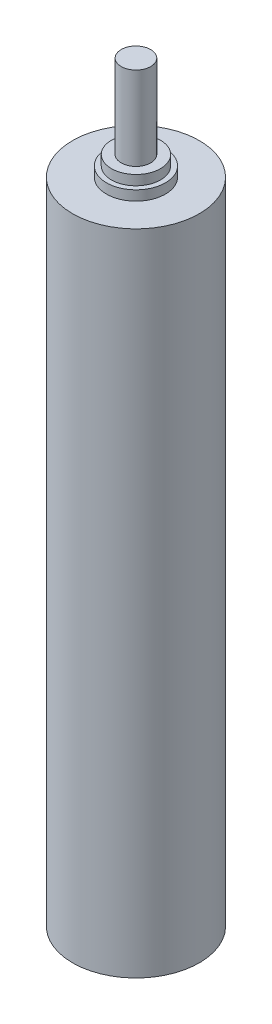
ISO-10303-21;
HEADER;
FILE_DESCRIPTION(('STEP AP214'),'2;1');
FILE_NAME('part.step','',(''),(''),'','','');
FILE_SCHEMA(('AUTOMOTIVE_DESIGN { 1 0 10303 214 1 1 1 1 }'));
ENDSEC;
DATA;
#1=APPLICATION_CONTEXT('core data for automotive mechanical design processes');
#2=APPLICATION_PROTOCOL_DEFINITION('international standard','automotive_design',2000,#1);
#3=PRODUCT_CONTEXT('',#1,'mechanical');
#4=PRODUCT('Part','Part','',(#3));
#5=PRODUCT_RELATED_PRODUCT_CATEGORY('part','',(#4));
#6=PRODUCT_DEFINITION_FORMATION('','',#4);
#7=PRODUCT_DEFINITION_CONTEXT('part definition',#1,'design');
#8=PRODUCT_DEFINITION('design','',#6,#7);
#9=PRODUCT_DEFINITION_SHAPE('','',#8);
#10=(LENGTH_UNIT() NAMED_UNIT(*) SI_UNIT(.MILLI.,.METRE.));
#11=(NAMED_UNIT(*) PLANE_ANGLE_UNIT() SI_UNIT($,.RADIAN.));
#12=(NAMED_UNIT(*) SI_UNIT($,.STERADIAN.) SOLID_ANGLE_UNIT());
#13=UNCERTAINTY_MEASURE_WITH_UNIT(LENGTH_MEASURE(1.E-05),#10,'distance_accuracy_value','');
#14=(GEOMETRIC_REPRESENTATION_CONTEXT(3) GLOBAL_UNCERTAINTY_ASSIGNED_CONTEXT((#13)) GLOBAL_UNIT_ASSIGNED_CONTEXT((#10,
#11,#12)) REPRESENTATION_CONTEXT('',''));
#15=CARTESIAN_POINT('',(0.,0.,0.));
#16=DIRECTION('',(0.,0.,1.));
#17=DIRECTION('',(1.,0.,0.));
#18=AXIS2_PLACEMENT_3D('',#15,#16,#17);
#19=CARTESIAN_POINT('',(0.,66.04,0.));
#20=DIRECTION('',(0.,1.,0.));
#21=DIRECTION('',(0.,0.,1.));
#22=AXIS2_PLACEMENT_3D('',#19,#20,#21);
#23=PLANE('',#22);
#24=CARTESIAN_POINT('',(0.,66.04,0.));
#25=DIRECTION('',(0.,1.,0.));
#26=DIRECTION('',(0.,0.,1.));
#27=AXIS2_PLACEMENT_3D('',#24,#25,#26);
#28=CIRCLE('',#27,6.4516);
#29=CARTESIAN_POINT('',(0.,66.04,6.4516));
#30=VERTEX_POINT('',#29);
#31=EDGE_CURVE('E10',#30,#30,#28,.T.);
#32=ORIENTED_EDGE('',*,*,#31,.T.);
#33=EDGE_LOOP('',(#32));
#34=FACE_BOUND('',#33,.T.);
#35=CARTESIAN_POINT('',(0.,66.04,0.));
#36=DIRECTION('',(0.,-1.,0.));
#37=DIRECTION('',(0.,0.,-1.));
#38=AXIS2_PLACEMENT_3D('',#35,#36,#37);
#39=CIRCLE('',#38,3.);
#40=CARTESIAN_POINT('',(0.,66.04,-3.));
#41=VERTEX_POINT('',#40);
#42=EDGE_CURVE('E58',#41,#41,#39,.T.);
#43=ORIENTED_EDGE('',*,*,#42,.T.);
#44=EDGE_LOOP('',(#43));
#45=FACE_BOUND('',#44,.T.);
#46=ADVANCED_FACE('F31',(#34,#45),#23,.T.);
#47=CARTESIAN_POINT('',(0.,66.04,0.));
#48=DIRECTION('',(0.,-1.,0.));
#49=DIRECTION('',(0.,0.,-1.));
#50=AXIS2_PLACEMENT_3D('',#47,#48,#49);
#51=CYLINDRICAL_SURFACE('',#50,6.4516);
#52=ORIENTED_EDGE('',*,*,#31,.F.);
#53=EDGE_LOOP('',(#52));
#54=FACE_BOUND('',#53,.T.);
#55=CARTESIAN_POINT('',(0.,0.,0.));
#56=DIRECTION('',(0.,1.,0.));
#57=DIRECTION('',(0.,0.,1.));
#58=AXIS2_PLACEMENT_3D('',#55,#56,#57);
#59=CIRCLE('',#58,6.4516);
#60=CARTESIAN_POINT('',(0.,0.,6.4516));
#61=VERTEX_POINT('',#60);
#62=EDGE_CURVE('E35',#61,#61,#59,.T.);
#63=ORIENTED_EDGE('',*,*,#62,.T.);
#64=EDGE_LOOP('',(#63));
#65=FACE_BOUND('',#64,.T.);
#66=ADVANCED_FACE('F33',(#54,#65),#51,.T.);
#67=CARTESIAN_POINT('',(0.,0.,0.));
#68=DIRECTION('',(0.,1.,0.));
#69=DIRECTION('',(0.,0.,1.));
#70=AXIS2_PLACEMENT_3D('',#67,#68,#69);
#71=PLANE('',#70);
#72=ORIENTED_EDGE('',*,*,#62,.F.);
#73=EDGE_LOOP('',(#72));
#74=FACE_BOUND('',#73,.T.);
#75=ADVANCED_FACE('F95',(#74),#71,.F.);
#76=CARTESIAN_POINT('',(0.,76.54,1.5));
#77=DIRECTION('',(0.,-1.,0.));
#78=DIRECTION('',(0.,0.,-1.));
#79=AXIS2_PLACEMENT_3D('',#76,#77,#78);
#80=PLANE('',#79);
#81=CARTESIAN_POINT('',(0.,76.54,0.));
#82=DIRECTION('',(0.,-1.,0.));
#83=DIRECTION('',(0.,0.,-1.));
#84=AXIS2_PLACEMENT_3D('',#81,#82,#83);
#85=CIRCLE('',#84,1.5);
#86=CARTESIAN_POINT('',(0.,76.54,-1.5));
#87=VERTEX_POINT('',#86);
#88=EDGE_CURVE('E42',#87,#87,#85,.T.);
#89=ORIENTED_EDGE('',*,*,#88,.F.);
#90=EDGE_LOOP('',(#89));
#91=FACE_BOUND('',#90,.T.);
#92=ADVANCED_FACE('F90',(#91),#80,.F.);
#93=CARTESIAN_POINT('',(0.,66.04,0.));
#94=DIRECTION('',(0.,-1.,0.));
#95=DIRECTION('',(0.,0.,-1.));
#96=AXIS2_PLACEMENT_3D('',#93,#94,#95);
#97=CYLINDRICAL_SURFACE('',#96,1.5);
#98=CARTESIAN_POINT('',(0.,68.04,0.));
#99=DIRECTION('',(0.,-1.,0.));
#100=DIRECTION('',(0.,0.,-1.));
#101=AXIS2_PLACEMENT_3D('',#98,#99,#100);
#102=CIRCLE('',#101,1.5);
#103=CARTESIAN_POINT('',(0.,68.04,-1.5));
#104=VERTEX_POINT('',#103);
#105=EDGE_CURVE('E46',#104,#104,#102,.T.);
#106=ORIENTED_EDGE('',*,*,#105,.F.);
#107=EDGE_LOOP('',(#106));
#108=FACE_BOUND('',#107,.T.);
#109=ORIENTED_EDGE('',*,*,#88,.T.);
#110=EDGE_LOOP('',(#109));
#111=FACE_BOUND('',#110,.T.);
#112=ADVANCED_FACE('F84',(#108,#111),#97,.T.);
#113=CARTESIAN_POINT('',(0.,68.04,2.5));
#114=DIRECTION('',(0.,-1.,0.));
#115=DIRECTION('',(0.,0.,-1.));
#116=AXIS2_PLACEMENT_3D('',#113,#114,#115);
#117=PLANE('',#116);
#118=CARTESIAN_POINT('',(0.,68.04,0.));
#119=DIRECTION('',(0.,-1.,0.));
#120=DIRECTION('',(0.,0.,-1.));
#121=AXIS2_PLACEMENT_3D('',#118,#119,#120);
#122=CIRCLE('',#121,2.5);
#123=CARTESIAN_POINT('',(0.,68.04,-2.5));
#124=VERTEX_POINT('',#123);
#125=EDGE_CURVE('E49',#124,#124,#122,.T.);
#126=ORIENTED_EDGE('',*,*,#125,.F.);
#127=EDGE_LOOP('',(#126));
#128=FACE_BOUND('',#127,.T.);
#129=ORIENTED_EDGE('',*,*,#105,.T.);
#130=EDGE_LOOP('',(#129));
#131=FACE_BOUND('',#130,.T.);
#132=ADVANCED_FACE('F78',(#128,#131),#117,.F.);
#133=CARTESIAN_POINT('',(0.,66.04,0.));
#134=DIRECTION('',(0.,-1.,0.));
#135=DIRECTION('',(0.,0.,-1.));
#136=AXIS2_PLACEMENT_3D('',#133,#134,#135);
#137=CYLINDRICAL_SURFACE('',#136,2.5);
#138=CARTESIAN_POINT('',(0.,67.04,0.));
#139=DIRECTION('',(0.,-1.,0.));
#140=DIRECTION('',(0.,0.,-1.));
#141=AXIS2_PLACEMENT_3D('',#138,#139,#140);
#142=CIRCLE('',#141,2.5);
#143=CARTESIAN_POINT('',(0.,67.04,-2.5));
#144=VERTEX_POINT('',#143);
#145=EDGE_CURVE('E52',#144,#144,#142,.T.);
#146=ORIENTED_EDGE('',*,*,#145,.F.);
#147=EDGE_LOOP('',(#146));
#148=FACE_BOUND('',#147,.T.);
#149=ORIENTED_EDGE('',*,*,#125,.T.);
#150=EDGE_LOOP('',(#149));
#151=FACE_BOUND('',#150,.T.);
#152=ADVANCED_FACE('F72',(#148,#151),#137,.T.);
#153=CARTESIAN_POINT('',(0.,67.04,3.));
#154=DIRECTION('',(0.,-1.,0.));
#155=DIRECTION('',(0.,0.,-1.));
#156=AXIS2_PLACEMENT_3D('',#153,#154,#155);
#157=PLANE('',#156);
#158=CARTESIAN_POINT('',(0.,67.04,0.));
#159=DIRECTION('',(0.,-1.,0.));
#160=DIRECTION('',(0.,0.,-1.));
#161=AXIS2_PLACEMENT_3D('',#158,#159,#160);
#162=CIRCLE('',#161,3.);
#163=CARTESIAN_POINT('',(0.,67.04,-3.));
#164=VERTEX_POINT('',#163);
#165=EDGE_CURVE('E55',#164,#164,#162,.T.);
#166=ORIENTED_EDGE('',*,*,#165,.F.);
#167=EDGE_LOOP('',(#166));
#168=FACE_BOUND('',#167,.T.);
#169=ORIENTED_EDGE('',*,*,#145,.T.);
#170=EDGE_LOOP('',(#169));
#171=FACE_BOUND('',#170,.T.);
#172=ADVANCED_FACE('F66',(#168,#171),#157,.F.);
#173=CARTESIAN_POINT('',(0.,66.04,0.));
#174=DIRECTION('',(0.,-1.,0.));
#175=DIRECTION('',(0.,0.,-1.));
#176=AXIS2_PLACEMENT_3D('',#173,#174,#175);
#177=CYLINDRICAL_SURFACE('',#176,3.);
#178=ORIENTED_EDGE('',*,*,#42,.F.);
#179=EDGE_LOOP('',(#178));
#180=FACE_BOUND('',#179,.T.);
#181=ORIENTED_EDGE('',*,*,#165,.T.);
#182=EDGE_LOOP('',(#181));
#183=FACE_BOUND('',#182,.T.);
#184=ADVANCED_FACE('F63',(#180,#183),#177,.T.);
#185=CLOSED_SHELL('',(#46,#66,#75,#92,#112,#132,#152,#172,#184));
#186=MANIFOLD_SOLID_BREP('B2',#185);
#187=ADVANCED_BREP_SHAPE_REPRESENTATION('',(#18,#186),#14);
#188=SHAPE_DEFINITION_REPRESENTATION(#9,#187);
ENDSEC;
END-ISO-10303-21;
